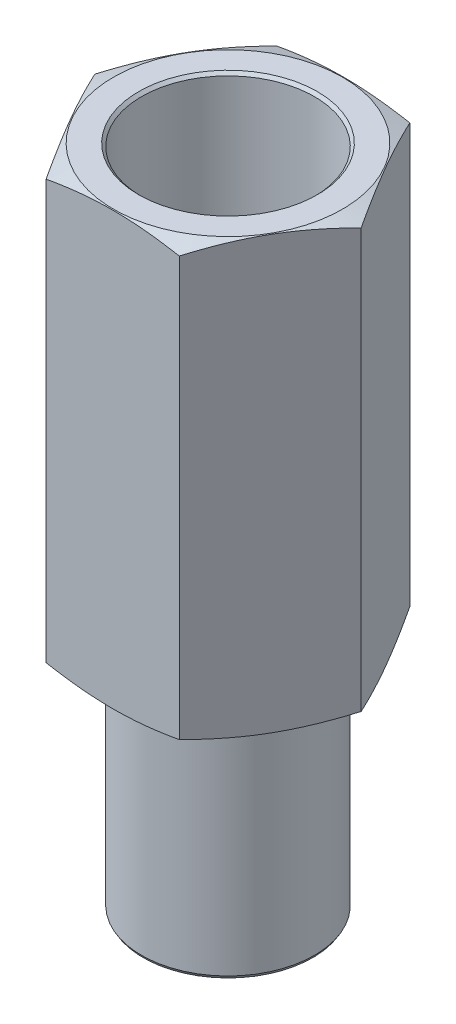
ISO-10303-21;
HEADER;
FILE_DESCRIPTION(('STEP AP214'),'2;1');
FILE_NAME('part.step','',(''),(''),'','','');
FILE_SCHEMA(('AUTOMOTIVE_DESIGN { 1 0 10303 214 1 1 1 1 }'));
ENDSEC;
DATA;
#1=APPLICATION_CONTEXT('core data for automotive mechanical design processes');
#2=APPLICATION_PROTOCOL_DEFINITION('international standard','automotive_design',2000,#1);
#3=PRODUCT_CONTEXT('',#1,'mechanical');
#4=PRODUCT('Part','Part','',(#3));
#5=PRODUCT_RELATED_PRODUCT_CATEGORY('part','',(#4));
#6=PRODUCT_DEFINITION_FORMATION('','',#4);
#7=PRODUCT_DEFINITION_CONTEXT('part definition',#1,'design');
#8=PRODUCT_DEFINITION('design','',#6,#7);
#9=PRODUCT_DEFINITION_SHAPE('','',#8);
#10=(LENGTH_UNIT() NAMED_UNIT(*) SI_UNIT(.MILLI.,.METRE.));
#11=(NAMED_UNIT(*) PLANE_ANGLE_UNIT() SI_UNIT($,.RADIAN.));
#12=(NAMED_UNIT(*) SI_UNIT($,.STERADIAN.) SOLID_ANGLE_UNIT());
#13=UNCERTAINTY_MEASURE_WITH_UNIT(LENGTH_MEASURE(1.E-05),#10,'distance_accuracy_value','');
#14=(GEOMETRIC_REPRESENTATION_CONTEXT(3) GLOBAL_UNCERTAINTY_ASSIGNED_CONTEXT((#13)) GLOBAL_UNIT_ASSIGNED_CONTEXT((#10,
#11,#12)) REPRESENTATION_CONTEXT('',''));
#15=CARTESIAN_POINT('',(0.,0.,0.));
#16=DIRECTION('',(0.,0.,1.));
#17=DIRECTION('',(1.,0.,0.));
#18=AXIS2_PLACEMENT_3D('',#15,#16,#17);
#19=CARTESIAN_POINT('',(0.,15.,0.));
#20=DIRECTION('',(0.,1.,0.));
#21=DIRECTION('',(0.,0.,1.));
#22=AXIS2_PLACEMENT_3D('',#19,#20,#21);
#23=PLANE('',#22);
#24=CARTESIAN_POINT('',(0.,15.,0.));
#25=DIRECTION('',(0.,1.,0.));
#26=DIRECTION('',(0.,0.,1.));
#27=AXIS2_PLACEMENT_3D('',#24,#25,#26);
#28=CIRCLE('',#27,3.10000000000003);
#29=CARTESIAN_POINT('',(0.,15.,3.10000000000003));
#30=VERTEX_POINT('',#29);
#31=EDGE_CURVE('E12',#30,#30,#28,.F.);
#32=ORIENTED_EDGE('',*,*,#31,.T.);
#33=EDGE_LOOP('',(#32));
#34=FACE_BOUND('',#33,.T.);
#35=CARTESIAN_POINT('',(0.,15.,0.));
#36=DIRECTION('',(0.,-1.,0.));
#37=DIRECTION('',(0.,0.,-1.));
#38=AXIS2_PLACEMENT_3D('',#35,#36,#37);
#39=CIRCLE('',#38,3.97080215351701);
#40=CARTESIAN_POINT('',(0.,15.,-3.97080215351701));
#41=VERTEX_POINT('',#40);
#42=EDGE_CURVE('E312',#41,#41,#39,.T.);
#43=ORIENTED_EDGE('',*,*,#42,.F.);
#44=EDGE_LOOP('',(#43));
#45=FACE_BOUND('',#44,.T.);
#46=ADVANCED_FACE('F43',(#34,#45),#23,.T.);
#47=CARTESIAN_POINT('',(0.,-8.48528137423857,0.));
#48=DIRECTION('',(0.,1.,0.));
#49=DIRECTION('',(0.,0.,1.));
#50=AXIS2_PLACEMENT_3D('',#47,#48,#49);
#51=CYLINDRICAL_SURFACE('',#50,3.);
#52=CARTESIAN_POINT('',(0.,14.9,0.));
#53=DIRECTION('',(0.,1.,0.));
#54=DIRECTION('',(0.,0.,1.));
#55=AXIS2_PLACEMENT_3D('',#52,#53,#54);
#56=CIRCLE('',#55,3.);
#57=CARTESIAN_POINT('',(0.,14.9,3.));
#58=VERTEX_POINT('',#57);
#59=EDGE_CURVE('E53',#58,#58,#56,.T.);
#60=CARTESIAN_POINT('',(0.,1.,0.));
#61=DIRECTION('',(0.,1.,0.));
#62=DIRECTION('',(0.,0.,1.));
#63=AXIS2_PLACEMENT_3D('',#60,#61,#62);
#64=CIRCLE('',#63,3.);
#65=CARTESIAN_POINT('',(0.,0.999999999999999,3.));
#66=VERTEX_POINT('',#65);
#67=EDGE_CURVE('E301',#66,#66,#64,.F.);
#68=CARTESIAN_POINT('',(0.,14.9,3.));
#69=CARTESIAN_POINT('',(0.,14.7552083333333,3.));
#70=CARTESIAN_POINT('',(0.,14.6104166666666,3.));
#71=CARTESIAN_POINT('',(0.,14.3208333333333,3.));
#72=CARTESIAN_POINT('',(0.,14.1760416666666,3.));
#73=CARTESIAN_POINT('',(0.,13.8864583333333,3.));
#74=CARTESIAN_POINT('',(0.,13.7416666666666,3.));
#75=CARTESIAN_POINT('',(0.,13.4520833333333,3.));
#76=CARTESIAN_POINT('',(0.,13.3072916666666,3.));
#77=CARTESIAN_POINT('',(0.,13.0177083333333,3.));
#78=CARTESIAN_POINT('',(0.,12.8729166666666,3.));
#79=CARTESIAN_POINT('',(0.,12.5833333333333,3.));
#80=CARTESIAN_POINT('',(0.,12.4385416666666,3.));
#81=CARTESIAN_POINT('',(0.,12.1489583333333,3.));
#82=CARTESIAN_POINT('',(0.,12.0041666666666,3.));
#83=CARTESIAN_POINT('',(0.,11.7145833333333,3.));
#84=CARTESIAN_POINT('',(0.,11.5697916666666,3.));
#85=CARTESIAN_POINT('',(0.,11.2802083333333,3.));
#86=CARTESIAN_POINT('',(0.,11.1354166666666,3.));
#87=CARTESIAN_POINT('',(0.,10.8458333333333,3.));
#88=CARTESIAN_POINT('',(0.,10.7010416666666,3.));
#89=CARTESIAN_POINT('',(0.,10.4114583333333,3.));
#90=CARTESIAN_POINT('',(0.,10.2666666666666,3.));
#91=CARTESIAN_POINT('',(0.,9.97708333333331,3.));
#92=CARTESIAN_POINT('',(0.,9.83229166666664,3.));
#93=CARTESIAN_POINT('',(0.,9.54270833333331,3.));
#94=CARTESIAN_POINT('',(0.,9.39791666666664,3.));
#95=CARTESIAN_POINT('',(0.,9.10833333333331,3.));
#96=CARTESIAN_POINT('',(0.,8.96354166666665,3.));
#97=CARTESIAN_POINT('',(0.,8.67395833333331,3.));
#98=CARTESIAN_POINT('',(0.,8.52916666666665,3.));
#99=CARTESIAN_POINT('',(0.,8.23958333333332,3.));
#100=CARTESIAN_POINT('',(0.,8.09479166666665,3.));
#101=CARTESIAN_POINT('',(0.,7.80520833333331,3.));
#102=CARTESIAN_POINT('',(0.,7.66041666666665,3.));
#103=CARTESIAN_POINT('',(0.,7.37083333333331,3.));
#104=CARTESIAN_POINT('',(0.,7.22604166666665,3.));
#105=CARTESIAN_POINT('',(0.,6.93645833333332,3.));
#106=CARTESIAN_POINT('',(0.,6.79166666666665,3.));
#107=CARTESIAN_POINT('',(0.,6.50208333333332,3.));
#108=CARTESIAN_POINT('',(0.,6.35729166666665,3.));
#109=CARTESIAN_POINT('',(0.,6.06770833333332,3.));
#110=CARTESIAN_POINT('',(0.,5.92291666666665,3.));
#111=CARTESIAN_POINT('',(0.,5.63333333333332,3.));
#112=CARTESIAN_POINT('',(0.,5.48854166666666,3.));
#113=CARTESIAN_POINT('',(0.,5.19895833333332,3.));
#114=CARTESIAN_POINT('',(0.,5.05416666666666,3.));
#115=CARTESIAN_POINT('',(0.,4.76458333333332,3.));
#116=CARTESIAN_POINT('',(0.,4.61979166666666,3.));
#117=CARTESIAN_POINT('',(0.,4.33020833333333,3.));
#118=CARTESIAN_POINT('',(0.,4.18541666666666,3.));
#119=CARTESIAN_POINT('',(0.,3.89583333333333,3.));
#120=CARTESIAN_POINT('',(0.,3.75104166666666,3.));
#121=CARTESIAN_POINT('',(0.,3.46145833333333,3.));
#122=CARTESIAN_POINT('',(0.,3.31666666666666,3.));
#123=CARTESIAN_POINT('',(0.,3.02708333333333,3.));
#124=CARTESIAN_POINT('',(0.,2.88229166666666,3.));
#125=CARTESIAN_POINT('',(0.,2.59270833333333,3.));
#126=CARTESIAN_POINT('',(0.,2.44791666666666,3.));
#127=CARTESIAN_POINT('',(0.,2.15833333333333,3.));
#128=CARTESIAN_POINT('',(0.,2.01354166666666,3.));
#129=CARTESIAN_POINT('',(0.,1.72395833333333,3.));
#130=CARTESIAN_POINT('',(0.,1.57916666666666,3.));
#131=CARTESIAN_POINT('',(0.,1.28958333333333,3.));
#132=CARTESIAN_POINT('',(0.,1.14479166666667,3.));
#133=CARTESIAN_POINT('',(0.,0.999999999999999,3.));
#134=B_SPLINE_CURVE_WITH_KNOTS('',3,(#68,#69,#70,#71,#72,#73,#74,#75,#76,#77,#78,#79,#80,#81,
#82,#83,#84,#85,#86,#87,#88,#89,#90,#91,#92,#93,#94,#95,#96,#97,#98,#99,#100,#101,#102,#103,
#104,#105,#106,#107,#108,#109,#110,#111,#112,#113,#114,#115,#116,#117,#118,#119,#120,#121,#122,
#123,#124,#125,#126,#127,#128,#129,#130,#131,#132,#133),.UNSPECIFIED.,.F.,.F.,(4,2,2,2,2,2,2,2,
2,2,2,2,2,2,2,2,2,2,2,2,2,2,2,2,2,2,2,2,2,2,2,2,4),(0.,0.434375000000001,0.868749999999998,
1.303125,1.7375,2.171875,2.60624999999999,3.04062499999999,3.47499999999999,3.90937499999999,
4.34374999999999,4.77812499999999,5.21249999999999,5.64687499999999,6.08124999999999,
6.51562499999998,6.94999999999998,7.38437499999998,7.81874999999998,8.25312499999998,
8.68749999999998,9.12187499999998,9.55624999999998,9.99062499999997,10.425,10.859375,11.29375,
11.728125,12.1625,12.596875,13.03125,13.465625,13.9),.UNSPECIFIED.);
#135=EDGE_CURVE('BSEAM143',#58,#66,#134,.T.);
#136=ORIENTED_EDGE('',*,*,#59,.T.);
#137=ORIENTED_EDGE('',*,*,#67,.T.);
#138=ORIENTED_EDGE('',*,*,#135,.T.);
#139=ORIENTED_EDGE('',*,*,#135,.F.);
#140=EDGE_LOOP('',(#136,#138,#137,#139));
#141=FACE_BOUND('',#140,.T.);
#142=ADVANCED_FACE('F143',(#141),#51,.F.);
#143=CARTESIAN_POINT('',(0.,1.,0.));
#144=DIRECTION('',(0.,1.,0.));
#145=DIRECTION('',(0.,0.,1.));
#146=AXIS2_PLACEMENT_3D('',#143,#144,#145);
#147=PLANE('',#146);
#148=ORIENTED_EDGE('',*,*,#67,.F.);
#149=EDGE_LOOP('',(#148));
#150=FACE_BOUND('',#149,.T.);
#151=ADVANCED_FACE('F161',(#150),#147,.T.);
#152=CARTESIAN_POINT('',(0.,14.7641472881955,0.));
#153=DIRECTION('',(0.,-1.,0.));
#154=DIRECTION('',(0.,0.,-1.));
#155=AXIS2_PLACEMENT_3D('',#152,#153,#154);
#156=CONICAL_SURFACE('',#155,4.61880215351701,1.22173047639604);
#157=ORIENTED_EDGE('',*,*,#42,.T.);
#158=EDGE_LOOP('',(#157));
#159=FACE_BOUND('',#158,.T.);
#160=CARTESIAN_POINT('',(4.61891762357085,14.764105258957,0.000199999999999064));
#161=CARTESIAN_POINT('',(4.52327074349373,14.7989319273994,-0.165465255879011));
#162=CARTESIAN_POINT('',(4.42730844809341,14.8306128881345,-0.331676827123302));
#163=CARTESIAN_POINT('',(4.23475986069894,14.8863507330612,-0.66518076341613));
#164=CARTESIAN_POINT('',(4.1381731403285,14.9104016505121,-0.832473870434188));
#165=CARTESIAN_POINT('',(3.9454476649718,14.9493033550701,-1.16628418566486));
#166=CARTESIAN_POINT('',(3.84931331199851,14.9642389981062,-1.33279376936735));
#167=CARTESIAN_POINT('',(3.65681977912949,14.9842719022397,-1.66620234842492));
#168=CARTESIAN_POINT('',(3.56046069713362,14.9893728529755,-1.83310117421246));
#169=CARTESIAN_POINT('',(3.36774253314189,14.9893728529755,-2.16689882578754));
#170=CARTESIAN_POINT('',(3.27138345114602,14.9842719022397,-2.33379765157508));
#171=CARTESIAN_POINT('',(3.078889918277,14.9642389981062,-2.66720623063265));
#172=CARTESIAN_POINT('',(2.98275556530371,14.9493033550701,-2.83371581433514));
#173=CARTESIAN_POINT('',(2.79003008994701,14.9104016505121,-3.16752612956581));
#174=CARTESIAN_POINT('',(2.69344336957657,14.8863507330612,-3.33481923658387));
#175=CARTESIAN_POINT('',(2.5008947821821,14.8306128881345,-3.6683231728767));
#176=CARTESIAN_POINT('',(2.40493248678178,14.7989319273994,-3.83453474412099));
#177=CARTESIAN_POINT('',(2.30928560670466,14.764105258957,-4.0002));
#178=B_SPLINE_CURVE_WITH_KNOTS('',3,(#160,#161,#162,#163,#164,#165,#166,#167,#168,#169,#170,
#171,#172,#173,#174,#175,#176,#177),.UNSPECIFIED.,.F.,.F.,(4,2,2,2,2,2,2,2,4),(0.,
0.583374670479608,1.16720442537842,1.74551281639333,2.32360420373111,2.90169559106889,
3.4800039820838,4.06383373698261,4.64720840746222),.UNSPECIFIED.);
#179=CARTESIAN_POINT('',(4.61880215351701,14.7641472881955,0.));
#180=VERTEX_POINT('',#179);
#181=CARTESIAN_POINT('',(2.3094010767585,14.7641472881955,-4.));
#182=VERTEX_POINT('',#181);
#183=EDGE_CURVE('E238',#180,#182,#178,.T.);
#184=ORIENTED_EDGE('',*,*,#183,.T.);
#185=CARTESIAN_POINT('',(6.93442105541701,13.5315317912641,-4.));
#186=CARTESIAN_POINT('',(6.79750528587559,13.5746962779455,-4.));
#187=CARTESIAN_POINT('',(6.66049928600478,13.6175745312444,-4.));
#188=CARTESIAN_POINT('',(6.38627763681627,13.7026615681037,-4.));
#189=CARTESIAN_POINT('',(6.24906198472095,13.7448703427085,-4.));
#190=CARTESIAN_POINT('',(5.83700082601678,13.8703639282712,-4.));
#191=CARTESIAN_POINT('',(5.56180233931622,13.9524966047382,-4.));
#192=CARTESIAN_POINT('',(5.00612466327753,14.1137770625323,-4.));
#193=CARTESIAN_POINT('',(4.72562742696804,14.1928630038912,-4.));
#194=CARTESIAN_POINT('',(4.16301593649549,14.3450721585253,-4.));
#195=CARTESIAN_POINT('',(3.88090174431779,14.4181955987557,-4.));
#196=CARTESIAN_POINT('',(3.32667471581513,14.5530931283784,-4.));
#197=CARTESIAN_POINT('',(3.05464851367353,14.6152182616514,-4.));
#198=CARTESIAN_POINT('',(2.50830917239681,14.7287453849072,-4.));
#199=CARTESIAN_POINT('',(2.23399588098652,14.7801466548659,-4.));
#200=CARTESIAN_POINT('',(1.68506942754389,14.8679792334375,-4.));
#201=CARTESIAN_POINT('',(1.41047515442929,14.904523748679,-4.));
#202=CARTESIAN_POINT('',(0.997259291342989,14.945585287118,-4.));
#203=CARTESIAN_POINT('',(0.859310804317415,14.9569795729521,-4.));
#204=CARTESIAN_POINT('',(0.583097750576372,14.9748161793434,-4.));
#205=CARTESIAN_POINT('',(0.444833206757896,14.9812588478914,-4.));
#206=CARTESIAN_POINT('',(0.155947129212635,14.9892910803361,-4.));
#207=CARTESIAN_POINT('',(0.00531195858881917,14.9904021547164,-4.));
#208=CARTESIAN_POINT('',(-0.295876555366577,14.9864236091773,-4.));
#209=CARTESIAN_POINT('',(-0.446429897623009,14.9813339096659,-4.));
#210=CARTESIAN_POINT('',(-0.747251476084304,14.9651769648813,-4.));
#211=CARTESIAN_POINT('',(-0.897519627044852,14.9541081503623,-4.));
#212=CARTESIAN_POINT('',(-1.19755177599525,14.9264442809033,-4.));
#213=CARTESIAN_POINT('',(-1.34731572409171,14.9098486944082,-4.));
#214=CARTESIAN_POINT('',(-1.7981263182841,14.8523443810178,-4.));
#215=CARTESIAN_POINT('',(-2.09821280481539,14.8038686192461,-4.));
#216=CARTESIAN_POINT('',(-2.6955298983362,14.6921414652265,-4.));
#217=CARTESIAN_POINT('',(-2.9927602619385,14.6288888251767,-4.));
#218=CARTESIAN_POINT('',(-3.59903309296772,14.4887443018965,-4.));
#219=CARTESIAN_POINT('',(-3.90795602267499,14.4113427018586,-4.));
#220=CARTESIAN_POINT('',(-4.52371095938154,14.2487563960846,-4.));
#221=CARTESIAN_POINT('',(-4.83054300430409,14.1635718319174,-4.));
#222=CARTESIAN_POINT('',(-5.43754564117105,13.9892562325163,-4.));
#223=CARTESIAN_POINT('',(-5.73774206315821,13.9002145638166,-4.));
#224=CARTESIAN_POINT('',(-6.18713862393114,13.763855156661,-4.));
#225=CARTESIAN_POINT('',(-6.33676810815596,13.717942114902,-4.));
#226=CARTESIAN_POINT('',(-6.63577438261097,13.6253097199274,-4.));
#227=CARTESIAN_POINT('',(-6.78515117745355,13.5785903816075,-4.));
#228=CARTESIAN_POINT('',(-6.93442105541701,13.5315317912641,-4.));
#229=B_SPLINE_CURVE_WITH_KNOTS('',3,(#185,#186,#187,#188,#189,#190,#191,#192,#193,#194,#195,
#196,#197,#198,#199,#200,#201,#202,#203,#204,#205,#206,#207,#208,#209,#210,#211,#212,#213,#214,
#215,#216,#217,#218,#219,#220,#221,#222,#223,#224,#225,#226,#227,#228),.UNSPECIFIED.,.F.,.F.,(4,
2,2,2,2,2,2,2,2,2,2,2,2,2,2,2,2,2,2,2,2,4),(0.,0.43067550758346,0.861356771401509,
1.7229119540411,2.5971661165428,3.47138698608137,4.30832109554915,5.14531138057395,
5.97579864841235,6.39097713249059,6.80612643591046,7.2579145452663,7.70970845374372,
8.16162099523028,8.61357701342838,9.52492298706625,10.4363459451995,11.3916096929876,
12.346856068385,13.2861915769522,13.7557353954807,14.22527054881),.UNSPECIFIED.);
#230=CARTESIAN_POINT('',(-2.3094010767585,14.7641472881955,-4.));
#231=VERTEX_POINT('',#230);
#232=EDGE_CURVE('E119',#182,#231,#229,.T.);
#233=ORIENTED_EDGE('',*,*,#232,.T.);
#234=CARTESIAN_POINT('',(-2.30928560670467,14.764105258957,-4.0002));
#235=CARTESIAN_POINT('',(-2.40493248678178,14.7989319273994,-3.83453474412099));
#236=CARTESIAN_POINT('',(-2.5008947821821,14.8306128881345,-3.6683231728767));
#237=CARTESIAN_POINT('',(-2.69344336957657,14.8863507330612,-3.33481923658387));
#238=CARTESIAN_POINT('',(-2.79003008994701,14.9104016505121,-3.16752612956581));
#239=CARTESIAN_POINT('',(-2.98275556530371,14.9493033550701,-2.83371581433514));
#240=CARTESIAN_POINT('',(-3.078889918277,14.9642389981062,-2.66720623063265));
#241=CARTESIAN_POINT('',(-3.27138345114602,14.9842719022397,-2.33379765157508));
#242=CARTESIAN_POINT('',(-3.36774253314189,14.9893728529755,-2.16689882578754));
#243=CARTESIAN_POINT('',(-3.56046069713362,14.9893728529755,-1.83310117421246));
#244=CARTESIAN_POINT('',(-3.65681977912949,14.9842719022397,-1.66620234842492));
#245=CARTESIAN_POINT('',(-3.84931331199851,14.9642389981062,-1.33279376936735));
#246=CARTESIAN_POINT('',(-3.9454476649718,14.9493033550701,-1.16628418566486));
#247=CARTESIAN_POINT('',(-4.1381731403285,14.9104016505121,-0.832473870434188));
#248=CARTESIAN_POINT('',(-4.23475986069894,14.8863507330612,-0.66518076341613));
#249=CARTESIAN_POINT('',(-4.42730844809341,14.8306128881345,-0.331676827123302));
#250=CARTESIAN_POINT('',(-4.52327074349373,14.7989319273994,-0.165465255879012));
#251=CARTESIAN_POINT('',(-4.61891762357084,14.764105258957,0.000199999999998637));
#252=B_SPLINE_CURVE_WITH_KNOTS('',3,(#234,#235,#236,#237,#238,#239,#240,#241,#242,#243,#244,
#245,#246,#247,#248,#249,#250,#251),.UNSPECIFIED.,.F.,.F.,(4,2,2,2,2,2,2,2,4),(0.,
0.583374670479609,1.16720442537842,1.74551281639333,2.32360420373111,2.90169559106889,
3.4800039820838,4.06383373698261,4.64720840746222),.UNSPECIFIED.);
#253=CARTESIAN_POINT('',(-4.61880215351701,14.7641472881955,0.));
#254=VERTEX_POINT('',#253);
#255=EDGE_CURVE('E225',#231,#254,#252,.T.);
#256=ORIENTED_EDGE('',*,*,#255,.T.);
#257=CARTESIAN_POINT('',(-4.61891762357084,14.764105258957,-0.000200000000001024));
#258=CARTESIAN_POINT('',(-4.52327074349373,14.7989319273994,0.165465255879009));
#259=CARTESIAN_POINT('',(-4.42730844809341,14.8306128881345,0.3316768271233));
#260=CARTESIAN_POINT('',(-4.23475986069894,14.8863507330612,0.665180763416128));
#261=CARTESIAN_POINT('',(-4.1381731403285,14.9104016505121,0.832473870434186));
#262=CARTESIAN_POINT('',(-3.9454476649718,14.9493033550701,1.16628418566486));
#263=CARTESIAN_POINT('',(-3.84931331199851,14.9642389981062,1.33279376936735));
#264=CARTESIAN_POINT('',(-3.65681977912949,14.9842719022397,1.66620234842492));
#265=CARTESIAN_POINT('',(-3.56046069713362,14.9893728529755,1.83310117421246));
#266=CARTESIAN_POINT('',(-3.36774253314189,14.9893728529755,2.16689882578754));
#267=CARTESIAN_POINT('',(-3.27138345114602,14.9842719022397,2.33379765157508));
#268=CARTESIAN_POINT('',(-3.078889918277,14.9642389981062,2.66720623063265));
#269=CARTESIAN_POINT('',(-2.98275556530371,14.9493033550701,2.83371581433514));
#270=CARTESIAN_POINT('',(-2.79003008994701,14.9104016505121,3.16752612956581));
#271=CARTESIAN_POINT('',(-2.69344336957657,14.8863507330612,3.33481923658387));
#272=CARTESIAN_POINT('',(-2.5008947821821,14.8306128881345,3.6683231728767));
#273=CARTESIAN_POINT('',(-2.40493248678178,14.7989319273994,3.83453474412099));
#274=CARTESIAN_POINT('',(-2.30928560670466,14.764105258957,4.0002));
#275=B_SPLINE_CURVE_WITH_KNOTS('',3,(#257,#258,#259,#260,#261,#262,#263,#264,#265,#266,#267,
#268,#269,#270,#271,#272,#273,#274),.UNSPECIFIED.,.F.,.F.,(4,2,2,2,2,2,2,2,4),(0.,
0.583374670479608,1.16720442537842,1.74551281639333,2.32360420373111,2.90169559106889,
3.4800039820838,4.06383373698261,4.64720840746222),.UNSPECIFIED.);
#276=CARTESIAN_POINT('',(-2.30940107675851,14.7641472881955,4.));
#277=VERTEX_POINT('',#276);
#278=EDGE_CURVE('E219',#254,#277,#275,.T.);
#279=ORIENTED_EDGE('',*,*,#278,.T.);
#280=CARTESIAN_POINT('',(-6.93442105541701,13.5315317912641,4.));
#281=CARTESIAN_POINT('',(-6.79750528587559,13.5746962779455,4.));
#282=CARTESIAN_POINT('',(-6.66049928600478,13.6175745312444,4.));
#283=CARTESIAN_POINT('',(-6.38627763681627,13.7026615681037,4.));
#284=CARTESIAN_POINT('',(-6.24906198472095,13.7448703427085,4.));
#285=CARTESIAN_POINT('',(-5.83700082601678,13.8703639282712,4.));
#286=CARTESIAN_POINT('',(-5.56180233931622,13.9524966047382,4.));
#287=CARTESIAN_POINT('',(-5.00612466327753,14.1137770625323,4.));
#288=CARTESIAN_POINT('',(-4.72562742696804,14.1928630038912,4.));
#289=CARTESIAN_POINT('',(-4.16301593649549,14.3450721585253,4.));
#290=CARTESIAN_POINT('',(-3.88090174431779,14.4181955987557,4.));
#291=CARTESIAN_POINT('',(-3.32667471581513,14.5530931283784,4.));
#292=CARTESIAN_POINT('',(-3.05464851367353,14.6152182616514,4.));
#293=CARTESIAN_POINT('',(-2.50830917239681,14.7287453849072,4.));
#294=CARTESIAN_POINT('',(-2.23399588098652,14.7801466548659,4.));
#295=CARTESIAN_POINT('',(-1.68506942754389,14.8679792334375,4.));
#296=CARTESIAN_POINT('',(-1.4104751544293,14.904523748679,4.));
#297=CARTESIAN_POINT('',(-0.997259291342992,14.945585287118,4.));
#298=CARTESIAN_POINT('',(-0.859310804317418,14.9569795729521,4.));
#299=CARTESIAN_POINT('',(-0.583097750576375,14.9748161793434,4.));
#300=CARTESIAN_POINT('',(-0.444833206757899,14.9812588478914,4.));
#301=CARTESIAN_POINT('',(-0.155947129212638,14.9892910803361,4.));
#302=CARTESIAN_POINT('',(-0.00531195858882182,14.9904021547164,4.));
#303=CARTESIAN_POINT('',(0.295876555366575,14.9864236091773,4.));
#304=CARTESIAN_POINT('',(0.446429897623007,14.9813339096659,4.));
#305=CARTESIAN_POINT('',(0.747251476084302,14.9651769648813,4.));
#306=CARTESIAN_POINT('',(0.897519627044849,14.9541081503623,4.));
#307=CARTESIAN_POINT('',(1.19755177599524,14.9264442809033,4.));
#308=CARTESIAN_POINT('',(1.34731572409171,14.9098486944082,4.));
#309=CARTESIAN_POINT('',(1.7981263182841,14.8523443810178,4.));
#310=CARTESIAN_POINT('',(2.09821280481539,14.8038686192461,4.));
#311=CARTESIAN_POINT('',(2.6955298983362,14.6921414652265,4.));
#312=CARTESIAN_POINT('',(2.9927602619385,14.6288888251767,4.));
#313=CARTESIAN_POINT('',(3.59903309296772,14.4887443018965,4.));
#314=CARTESIAN_POINT('',(3.90795602267499,14.4113427018586,4.));
#315=CARTESIAN_POINT('',(4.52371095938154,14.2487563960846,4.));
#316=CARTESIAN_POINT('',(4.83054300430409,14.1635718319174,4.));
#317=CARTESIAN_POINT('',(5.43754564117105,13.9892562325163,4.));
#318=CARTESIAN_POINT('',(5.73774206315821,13.9002145638166,4.));
#319=CARTESIAN_POINT('',(6.18713862393114,13.763855156661,4.));
#320=CARTESIAN_POINT('',(6.33676810815596,13.717942114902,4.));
#321=CARTESIAN_POINT('',(6.63577438261097,13.6253097199274,4.));
#322=CARTESIAN_POINT('',(6.78515117745355,13.5785903816075,4.));
#323=CARTESIAN_POINT('',(6.93442105541701,13.5315317912641,4.));
#324=B_SPLINE_CURVE_WITH_KNOTS('',3,(#280,#281,#282,#283,#284,#285,#286,#287,#288,#289,#290,
#291,#292,#293,#294,#295,#296,#297,#298,#299,#300,#301,#302,#303,#304,#305,#306,#307,#308,#309,
#310,#311,#312,#313,#314,#315,#316,#317,#318,#319,#320,#321,#322,#323),.UNSPECIFIED.,.F.,.F.,(4,
2,2,2,2,2,2,2,2,2,2,2,2,2,2,2,2,2,2,2,2,4),(0.,0.43067550758346,0.86135677140151,
1.7229119540411,2.5971661165428,3.47138698608136,4.30832109554915,5.14531138057395,
5.97579864841235,6.39097713249058,6.80612643591046,7.2579145452663,7.70970845374372,
8.16162099523028,8.61357701342838,9.52492298706625,10.4363459451995,11.3916096929876,
12.346856068385,13.2861915769522,13.7557353954807,14.22527054881),.UNSPECIFIED.);
#325=CARTESIAN_POINT('',(2.3094010767585,14.7641472881955,4.));
#326=VERTEX_POINT('',#325);
#327=EDGE_CURVE('E60',#277,#326,#324,.T.);
#328=ORIENTED_EDGE('',*,*,#327,.T.);
#329=CARTESIAN_POINT('',(2.30928560670467,14.764105258957,4.0002));
#330=CARTESIAN_POINT('',(2.40493248678178,14.7989319273994,3.83453474412099));
#331=CARTESIAN_POINT('',(2.5008947821821,14.8306128881345,3.6683231728767));
#332=CARTESIAN_POINT('',(2.69344336957657,14.8863507330612,3.33481923658387));
#333=CARTESIAN_POINT('',(2.79003008994701,14.9104016505121,3.16752612956581));
#334=CARTESIAN_POINT('',(2.98275556530371,14.9493033550701,2.83371581433514));
#335=CARTESIAN_POINT('',(3.078889918277,14.9642389981062,2.66720623063265));
#336=CARTESIAN_POINT('',(3.27138345114602,14.9842719022397,2.33379765157508));
#337=CARTESIAN_POINT('',(3.36774253314189,14.9893728529755,2.16689882578754));
#338=CARTESIAN_POINT('',(3.56046069713362,14.9893728529755,1.83310117421246));
#339=CARTESIAN_POINT('',(3.65681977912949,14.9842719022397,1.66620234842492));
#340=CARTESIAN_POINT('',(3.84931331199851,14.9642389981062,1.33279376936735));
#341=CARTESIAN_POINT('',(3.9454476649718,14.9493033550701,1.16628418566486));
#342=CARTESIAN_POINT('',(4.1381731403285,14.9104016505121,0.832473870434186));
#343=CARTESIAN_POINT('',(4.23475986069894,14.8863507330612,0.665180763416128));
#344=CARTESIAN_POINT('',(4.42730844809341,14.8306128881345,0.3316768271233));
#345=CARTESIAN_POINT('',(4.52327074349373,14.7989319273994,0.165465255879009));
#346=CARTESIAN_POINT('',(4.61891762357085,14.764105258957,-0.000200000000001258));
#347=B_SPLINE_CURVE_WITH_KNOTS('',3,(#329,#330,#331,#332,#333,#334,#335,#336,#337,#338,#339,
#340,#341,#342,#343,#344,#345,#346),.UNSPECIFIED.,.F.,.F.,(4,2,2,2,2,2,2,2,4),(0.,
0.583374670479608,1.16720442537842,1.74551281639333,2.32360420373111,2.90169559106889,
3.4800039820838,4.06383373698261,4.64720840746222),.UNSPECIFIED.);
#348=EDGE_CURVE('E115',#326,#180,#347,.T.);
#349=ORIENTED_EDGE('',*,*,#348,.T.);
#350=EDGE_LOOP('',(#184,#233,#256,#279,#328,#349));
#351=FACE_BOUND('',#350,.T.);
#352=ADVANCED_FACE('F176',(#159,#351),#156,.T.);
#353=CARTESIAN_POINT('',(2.3094010767585,15.,4.));
#354=DIRECTION('',(-0.866025403784438,0.,-0.5));
#355=DIRECTION('',(-0.5,0.,0.866025403784439));
#356=AXIS2_PLACEMENT_3D('',#353,#354,#355);
#357=PLANE('',#356);
#358=CARTESIAN_POINT('',(4.61891762357085,0.235894741043041,-0.000200000000001065));
#359=CARTESIAN_POINT('',(4.52327074349373,0.201068072600558,0.165465255879009));
#360=CARTESIAN_POINT('',(4.42730844809341,0.169387111865529,0.3316768271233));
#361=CARTESIAN_POINT('',(4.23475986069894,0.113649266938842,0.665180763416128));
#362=CARTESIAN_POINT('',(4.1381731403285,0.0895983494878928,0.832473870434186));
#363=CARTESIAN_POINT('',(3.9454476649718,0.0506966449299209,1.16628418566486));
#364=CARTESIAN_POINT('',(3.84931331199851,0.0357610018938267,1.33279376936735));
#365=CARTESIAN_POINT('',(3.65681977912949,0.0157280977603333,1.66620234842492));
#366=CARTESIAN_POINT('',(3.56046069713362,0.0106271470244839,1.83310117421246));
#367=CARTESIAN_POINT('',(3.36774253314189,0.0106271470244839,2.16689882578754));
#368=CARTESIAN_POINT('',(3.27138345114602,0.0157280977603332,2.33379765157508));
#369=CARTESIAN_POINT('',(3.078889918277,0.0357610018938266,2.66720623063265));
#370=CARTESIAN_POINT('',(2.98275556530371,0.0506966449299208,2.83371581433514));
#371=CARTESIAN_POINT('',(2.79003008994701,0.0895983494878925,3.16752612956581));
#372=CARTESIAN_POINT('',(2.69344336957657,0.113649266938842,3.33481923658387));
#373=CARTESIAN_POINT('',(2.5008947821821,0.169387111865528,3.6683231728767));
#374=CARTESIAN_POINT('',(2.40493248678178,0.201068072600557,3.83453474412099));
#375=CARTESIAN_POINT('',(2.30928560670467,0.23589474104304,4.0002));
#376=B_SPLINE_CURVE_WITH_KNOTS('',3,(#358,#359,#360,#361,#362,#363,#364,#365,#366,#367,#368,
#369,#370,#371,#372,#373,#374,#375),.UNSPECIFIED.,.F.,.F.,(4,2,2,2,2,2,2,2,4),(0.,
0.583374670479608,1.16720442537842,1.74551281639333,2.32360420373111,2.90169559106889,
3.4800039820838,4.06383373698261,4.64720840746222),.UNSPECIFIED.);
#377=CARTESIAN_POINT('',(4.61880215351701,0.235852711804495,0.));
#378=VERTEX_POINT('',#377);
#379=CARTESIAN_POINT('',(2.3094010767585,0.235852711804495,4.));
#380=VERTEX_POINT('',#379);
#381=EDGE_CURVE('E182',#378,#380,#376,.T.);
#382=ORIENTED_EDGE('',*,*,#381,.F.);
#383=DIRECTION('',(0.,-1.,0.));
#384=VECTOR('',#383,1.);
#385=CARTESIAN_POINT('',(4.61880215351701,15.,0.));
#386=LINE('',#385,#384);
#387=EDGE_CURVE('E113',#180,#378,#386,.T.);
#388=ORIENTED_EDGE('',*,*,#387,.F.);
#389=ORIENTED_EDGE('',*,*,#348,.F.);
#390=DIRECTION('',(0.,-1.,0.));
#391=VECTOR('',#390,1.);
#392=CARTESIAN_POINT('',(2.3094010767585,15.,4.));
#393=LINE('',#392,#391);
#394=EDGE_CURVE('E294',#326,#380,#393,.T.);
#395=ORIENTED_EDGE('',*,*,#394,.T.);
#396=EDGE_LOOP('',(#382,#388,#389,#395));
#397=FACE_BOUND('',#396,.T.);
#398=ADVANCED_FACE('F171',(#397),#357,.F.);
#399=CARTESIAN_POINT('',(-2.3094010767585,15.,4.));
#400=DIRECTION('',(0.,0.,-1.));
#401=DIRECTION('',(-1.,0.,0.));
#402=AXIS2_PLACEMENT_3D('',#399,#400,#401);
#403=PLANE('',#402);
#404=CARTESIAN_POINT('',(6.93442105541701,1.46846820873595,4.));
#405=CARTESIAN_POINT('',(6.79750528587559,1.42530372205454,4.));
#406=CARTESIAN_POINT('',(6.66049928600478,1.3824254687556,4.));
#407=CARTESIAN_POINT('',(6.38627763681627,1.29733843189633,4.));
#408=CARTESIAN_POINT('',(6.24906198472096,1.25512965729153,4.));
#409=CARTESIAN_POINT('',(5.83700082601679,1.12963607172881,4.));
#410=CARTESIAN_POINT('',(5.56180233931623,1.04750339526185,4.));
#411=CARTESIAN_POINT('',(5.00612466327755,0.886222937467692,4.));
#412=CARTESIAN_POINT('',(4.72562742696805,0.807136996108761,4.));
#413=CARTESIAN_POINT('',(4.16301593649551,0.654927841474713,4.));
#414=CARTESIAN_POINT('',(3.88090174431781,0.581804401244294,4.));
#415=CARTESIAN_POINT('',(3.32667471581515,0.446906871621624,4.));
#416=CARTESIAN_POINT('',(3.05464851367355,0.384781738348636,4.));
#417=CARTESIAN_POINT('',(2.50830917239683,0.271254615092766,4.));
#418=CARTESIAN_POINT('',(2.23399588098654,0.219853345134058,4.));
#419=CARTESIAN_POINT('',(1.68506942754392,0.132020766562519,4.));
#420=CARTESIAN_POINT('',(1.41047515442933,0.095476251320985,4.));
#421=CARTESIAN_POINT('',(0.997259291343024,0.0544147128819589,4.));
#422=CARTESIAN_POINT('',(0.859310804317451,0.0430204270479422,4.));
#423=CARTESIAN_POINT('',(0.58309775057641,0.0251838206566128,4.));
#424=CARTESIAN_POINT('',(0.444833206757935,0.0187411521086326,4.));
#425=CARTESIAN_POINT('',(0.155947129212674,0.010708919663933,4.));
#426=CARTESIAN_POINT('',(0.0053119585888566,0.00959784528355729,4.));
#427=CARTESIAN_POINT('',(-0.295876555366542,0.0135763908226936,4.));
#428=CARTESIAN_POINT('',(-0.446429897622974,0.0186660903340807,4.));
#429=CARTESIAN_POINT('',(-0.747251476084271,0.034823035118695,4.));
#430=CARTESIAN_POINT('',(-0.89751962704482,0.0458918496377199,4.));
#431=CARTESIAN_POINT('',(-1.19755177599522,0.073555719096668,4.));
#432=CARTESIAN_POINT('',(-1.34731572409169,0.0901513055917945,4.));
#433=CARTESIAN_POINT('',(-1.79812631828407,0.147655618982208,4.));
#434=CARTESIAN_POINT('',(-2.09821280481537,0.196131380753924,4.));
#435=CARTESIAN_POINT('',(-2.69552989833618,0.30785853477353,4.));
#436=CARTESIAN_POINT('',(-2.99276026193848,0.371111174823291,4.));
#437=CARTESIAN_POINT('',(-3.5990330929677,0.511255698103514,4.));
#438=CARTESIAN_POINT('',(-3.90795602267497,0.588657298141389,4.));
#439=CARTESIAN_POINT('',(-4.52371095938153,0.751243603915377,4.));
#440=CARTESIAN_POINT('',(-4.83054300430409,0.836428168082622,4.));
#441=CARTESIAN_POINT('',(-5.43754564117104,1.01074376748371,4.));
#442=CARTESIAN_POINT('',(-5.73774206315821,1.09978543618339,4.));
#443=CARTESIAN_POINT('',(-6.18713862393114,1.23614484333896,4.));
#444=CARTESIAN_POINT('',(-6.33676810815596,1.28205788509802,4.));
#445=CARTESIAN_POINT('',(-6.63577438261097,1.37469028007264,4.));
#446=CARTESIAN_POINT('',(-6.78515117745355,1.42140961839248,4.));
#447=CARTESIAN_POINT('',(-6.93442105541701,1.46846820873595,4.));
#448=B_SPLINE_CURVE_WITH_KNOTS('',3,(#404,#405,#406,#407,#408,#409,#410,#411,#412,#413,#414,
#415,#416,#417,#418,#419,#420,#421,#422,#423,#424,#425,#426,#427,#428,#429,#430,#431,#432,#433,
#434,#435,#436,#437,#438,#439,#440,#441,#442,#443,#444,#445,#446,#447),.UNSPECIFIED.,.F.,.F.,(4,
2,2,2,2,2,2,2,2,2,2,2,2,2,2,2,2,2,2,2,2,4),(0.,0.430675507583459,0.861356771401505,
1.72291195404109,2.59716611654279,3.47138698608135,4.30832109554913,5.14531138057393,
5.97579864841232,6.39097713249055,6.80612643591042,7.25791454526627,7.70970845374369,
8.16162099523025,8.61357701342835,9.52492298706623,10.4363459451994,11.3916096929876,
12.346856068385,13.2861915769522,13.7557353954807,14.22527054881),.UNSPECIFIED.);
#449=CARTESIAN_POINT('',(-2.3094010767585,0.235852711804495,4.));
#450=VERTEX_POINT('',#449);
#451=EDGE_CURVE('E267',#380,#450,#448,.T.);
#452=ORIENTED_EDGE('',*,*,#451,.F.);
#453=ORIENTED_EDGE('',*,*,#394,.F.);
#454=ORIENTED_EDGE('',*,*,#327,.F.);
#455=DIRECTION('',(0.,-1.,0.));
#456=VECTOR('',#455,1.);
#457=CARTESIAN_POINT('',(-2.3094010767585,15.,4.));
#458=LINE('',#457,#456);
#459=EDGE_CURVE('E288',#277,#450,#458,.T.);
#460=ORIENTED_EDGE('',*,*,#459,.T.);
#461=EDGE_LOOP('',(#452,#453,#454,#460));
#462=FACE_BOUND('',#461,.T.);
#463=ADVANCED_FACE('F175',(#462),#403,.F.);
#464=CARTESIAN_POINT('',(-4.61880215351701,15.,0.));
#465=DIRECTION('',(0.866025403784438,0.,-0.5));
#466=DIRECTION('',(-0.5,0.,-0.866025403784439));
#467=AXIS2_PLACEMENT_3D('',#464,#465,#466);
#468=PLANE('',#467);
#469=CARTESIAN_POINT('',(-2.30928560670466,0.23589474104304,4.0002));
#470=CARTESIAN_POINT('',(-2.40493248678178,0.201068072600557,3.83453474412099));
#471=CARTESIAN_POINT('',(-2.5008947821821,0.169387111865528,3.6683231728767));
#472=CARTESIAN_POINT('',(-2.69344336957657,0.113649266938842,3.33481923658387));
#473=CARTESIAN_POINT('',(-2.79003008994701,0.0895983494878924,3.16752612956581));
#474=CARTESIAN_POINT('',(-2.98275556530371,0.0506966449299206,2.83371581433514));
#475=CARTESIAN_POINT('',(-3.078889918277,0.0357610018938263,2.66720623063265));
#476=CARTESIAN_POINT('',(-3.27138345114602,0.015728097760333,2.33379765157508));
#477=CARTESIAN_POINT('',(-3.36774253314189,0.0106271470244838,2.16689882578754));
#478=CARTESIAN_POINT('',(-3.56046069713362,0.0106271470244838,1.83310117421246));
#479=CARTESIAN_POINT('',(-3.65681977912949,0.015728097760333,1.66620234842492));
#480=CARTESIAN_POINT('',(-3.84931331199851,0.0357610018938262,1.33279376936735));
#481=CARTESIAN_POINT('',(-3.9454476649718,0.0506966449299203,1.16628418566486));
#482=CARTESIAN_POINT('',(-4.1381731403285,0.0895983494878922,0.832473870434187));
#483=CARTESIAN_POINT('',(-4.23475986069894,0.113649266938842,0.66518076341613));
#484=CARTESIAN_POINT('',(-4.42730844809341,0.169387111865528,0.331676827123301));
#485=CARTESIAN_POINT('',(-4.52327074349373,0.201068072600557,0.16546525587901));
#486=CARTESIAN_POINT('',(-4.61891762357084,0.23589474104304,-0.000200000000000051));
#487=B_SPLINE_CURVE_WITH_KNOTS('',3,(#469,#470,#471,#472,#473,#474,#475,#476,#477,#478,#479,
#480,#481,#482,#483,#484,#485,#486),.UNSPECIFIED.,.F.,.F.,(4,2,2,2,2,2,2,2,4),(0.,
0.583374670479608,1.16720442537842,1.74551281639333,2.32360420373111,2.90169559106889,
3.4800039820838,4.06383373698261,4.64720840746222),.UNSPECIFIED.);
#488=CARTESIAN_POINT('',(-4.618802153517,0.235852711804495,0.));
#489=VERTEX_POINT('',#488);
#490=EDGE_CURVE('E261',#450,#489,#487,.T.);
#491=ORIENTED_EDGE('',*,*,#490,.F.);
#492=ORIENTED_EDGE('',*,*,#459,.F.);
#493=ORIENTED_EDGE('',*,*,#278,.F.);
#494=DIRECTION('',(0.,-1.,0.));
#495=VECTOR('',#494,1.);
#496=CARTESIAN_POINT('',(-4.61880215351701,15.,0.));
#497=LINE('',#496,#495);
#498=EDGE_CURVE('E129',#254,#489,#497,.T.);
#499=ORIENTED_EDGE('',*,*,#498,.T.);
#500=EDGE_LOOP('',(#491,#492,#493,#499));
#501=FACE_BOUND('',#500,.T.);
#502=ADVANCED_FACE('F272',(#501),#468,.F.);
#503=CARTESIAN_POINT('',(-2.3094010767585,15.,-4.));
#504=DIRECTION('',(0.866025403784439,0.,0.5));
#505=DIRECTION('',(0.5,0.,-0.866025403784439));
#506=AXIS2_PLACEMENT_3D('',#503,#504,#505);
#507=PLANE('',#506);
#508=CARTESIAN_POINT('',(-4.61891762357084,0.23589474104304,0.000199999999999153));
#509=CARTESIAN_POINT('',(-4.52327074349373,0.201068072600557,-0.165465255879011));
#510=CARTESIAN_POINT('',(-4.42730844809341,0.169387111865529,-0.331676827123302));
#511=CARTESIAN_POINT('',(-4.23475986069894,0.113649266938842,-0.66518076341613));
#512=CARTESIAN_POINT('',(-4.1381731403285,0.0895983494878926,-0.832473870434188));
#513=CARTESIAN_POINT('',(-3.9454476649718,0.0506966449299208,-1.16628418566486));
#514=CARTESIAN_POINT('',(-3.84931331199851,0.0357610018938266,-1.33279376936735));
#515=CARTESIAN_POINT('',(-3.65681977912949,0.0157280977603333,-1.66620234842492));
#516=CARTESIAN_POINT('',(-3.56046069713362,0.0106271470244841,-1.83310117421246));
#517=CARTESIAN_POINT('',(-3.36774253314189,0.0106271470244841,-2.16689882578754));
#518=CARTESIAN_POINT('',(-3.27138345114602,0.0157280977603333,-2.33379765157508));
#519=CARTESIAN_POINT('',(-3.078889918277,0.0357610018938266,-2.66720623063265));
#520=CARTESIAN_POINT('',(-2.98275556530371,0.0506966449299207,-2.83371581433514));
#521=CARTESIAN_POINT('',(-2.79003008994701,0.0895983494878925,-3.16752612956581));
#522=CARTESIAN_POINT('',(-2.69344336957657,0.113649266938842,-3.33481923658387));
#523=CARTESIAN_POINT('',(-2.5008947821821,0.169387111865528,-3.6683231728767));
#524=CARTESIAN_POINT('',(-2.40493248678178,0.201068072600557,-3.83453474412099));
#525=CARTESIAN_POINT('',(-2.30928560670467,0.23589474104304,-4.0002));
#526=B_SPLINE_CURVE_WITH_KNOTS('',3,(#508,#509,#510,#511,#512,#513,#514,#515,#516,#517,#518,
#519,#520,#521,#522,#523,#524,#525),.UNSPECIFIED.,.F.,.F.,(4,2,2,2,2,2,2,2,4),(0.,
0.583374670479608,1.16720442537842,1.74551281639333,2.32360420373111,2.90169559106889,
3.4800039820838,4.06383373698261,4.64720840746222),.UNSPECIFIED.);
#527=CARTESIAN_POINT('',(-2.3094010767585,0.235852711804495,-4.));
#528=VERTEX_POINT('',#527);
#529=EDGE_CURVE('E99',#489,#528,#526,.T.);
#530=ORIENTED_EDGE('',*,*,#529,.F.);
#531=ORIENTED_EDGE('',*,*,#498,.F.);
#532=ORIENTED_EDGE('',*,*,#255,.F.);
#533=DIRECTION('',(0.,-1.,0.));
#534=VECTOR('',#533,1.);
#535=CARTESIAN_POINT('',(-2.3094010767585,15.,-4.));
#536=LINE('',#535,#534);
#537=EDGE_CURVE('E122',#231,#528,#536,.T.);
#538=ORIENTED_EDGE('',*,*,#537,.T.);
#539=EDGE_LOOP('',(#530,#531,#532,#538));
#540=FACE_BOUND('',#539,.T.);
#541=ADVANCED_FACE('F246',(#540),#507,.F.);
#542=CARTESIAN_POINT('',(2.3094010767585,15.,-4.));
#543=DIRECTION('',(0.,0.,1.));
#544=DIRECTION('',(1.,0.,0.));
#545=AXIS2_PLACEMENT_3D('',#542,#543,#544);
#546=PLANE('',#545);
#547=CARTESIAN_POINT('',(-6.93442105541701,1.46846820873595,-4.));
#548=CARTESIAN_POINT('',(-6.79750528587559,1.42530372205454,-4.));
#549=CARTESIAN_POINT('',(-6.66049928600478,1.3824254687556,-4.));
#550=CARTESIAN_POINT('',(-6.38627763681628,1.29733843189633,-4.));
#551=CARTESIAN_POINT('',(-6.24906198472096,1.25512965729153,-4.));
#552=CARTESIAN_POINT('',(-5.83700082601679,1.12963607172881,-4.));
#553=CARTESIAN_POINT('',(-5.56180233931623,1.04750339526185,-4.));
#554=CARTESIAN_POINT('',(-5.00612466327755,0.886222937467692,-4.));
#555=CARTESIAN_POINT('',(-4.72562742696805,0.807136996108761,-4.));
#556=CARTESIAN_POINT('',(-4.16301593649551,0.654927841474713,-4.));
#557=CARTESIAN_POINT('',(-3.88090174431781,0.581804401244294,-4.));
#558=CARTESIAN_POINT('',(-3.32667471581515,0.446906871621624,-4.));
#559=CARTESIAN_POINT('',(-3.05464851367355,0.384781738348637,-4.));
#560=CARTESIAN_POINT('',(-2.50830917239683,0.271254615092766,-4.));
#561=CARTESIAN_POINT('',(-2.23399588098654,0.219853345134059,-4.));
#562=CARTESIAN_POINT('',(-1.68506942754392,0.132020766562519,-4.));
#563=CARTESIAN_POINT('',(-1.41047515442933,0.0954762513209858,-4.));
#564=CARTESIAN_POINT('',(-0.997259291343025,0.0544147128819596,-4.));
#565=CARTESIAN_POINT('',(-0.859310804317451,0.0430204270479426,-4.));
#566=CARTESIAN_POINT('',(-0.58309775057641,0.0251838206566132,-4.));
#567=CARTESIAN_POINT('',(-0.444833206757935,0.0187411521086331,-4.));
#568=CARTESIAN_POINT('',(-0.155947129212674,0.0107089196639335,-4.));
#569=CARTESIAN_POINT('',(-0.00531195858885668,0.0095978452835577,-4.));
#570=CARTESIAN_POINT('',(0.295876555366542,0.0135763908226941,-4.));
#571=CARTESIAN_POINT('',(0.446429897622974,0.0186660903340815,-4.));
#572=CARTESIAN_POINT('',(0.747251476084271,0.034823035118696,-4.));
#573=CARTESIAN_POINT('',(0.89751962704482,0.0458918496377208,-4.));
#574=CARTESIAN_POINT('',(1.19755177599522,0.0735557190966688,-4.));
#575=CARTESIAN_POINT('',(1.34731572409169,0.0901513055917951,-4.));
#576=CARTESIAN_POINT('',(1.79812631828407,0.147655618982209,-4.));
#577=CARTESIAN_POINT('',(2.09821280481537,0.196131380753925,-4.));
#578=CARTESIAN_POINT('',(2.69552989833618,0.307858534773531,-4.));
#579=CARTESIAN_POINT('',(2.99276026193848,0.371111174823291,-4.));
#580=CARTESIAN_POINT('',(3.5990330929677,0.511255698103515,-4.));
#581=CARTESIAN_POINT('',(3.90795602267497,0.588657298141389,-4.));
#582=CARTESIAN_POINT('',(4.52371095938153,0.751243603915377,-4.));
#583=CARTESIAN_POINT('',(4.83054300430408,0.836428168082623,-4.));
#584=CARTESIAN_POINT('',(5.43754564117104,1.01074376748371,-4.));
#585=CARTESIAN_POINT('',(5.73774206315821,1.09978543618339,-4.));
#586=CARTESIAN_POINT('',(6.18713862393114,1.23614484333896,-4.));
#587=CARTESIAN_POINT('',(6.33676810815596,1.28205788509802,-4.));
#588=CARTESIAN_POINT('',(6.63577438261097,1.37469028007264,-4.));
#589=CARTESIAN_POINT('',(6.78515117745355,1.42140961839248,-4.));
#590=CARTESIAN_POINT('',(6.93442105541701,1.46846820873595,-4.));
#591=B_SPLINE_CURVE_WITH_KNOTS('',3,(#547,#548,#549,#550,#551,#552,#553,#554,#555,#556,#557,
#558,#559,#560,#561,#562,#563,#564,#565,#566,#567,#568,#569,#570,#571,#572,#573,#574,#575,#576,
#577,#578,#579,#580,#581,#582,#583,#584,#585,#586,#587,#588,#589,#590),.UNSPECIFIED.,.F.,.F.,(4,
2,2,2,2,2,2,2,2,2,2,2,2,2,2,2,2,2,2,2,2,4),(0.,0.430675507583458,0.861356771401505,
1.72291195404109,2.59716611654279,3.47138698608135,4.30832109554913,5.14531138057393,
5.97579864841232,6.39097713249055,6.80612643591042,7.25791454526627,7.70970845374369,
8.16162099523025,8.61357701342835,9.52492298706623,10.4363459451994,11.3916096929876,
12.346856068385,13.2861915769522,13.7557353954807,14.22527054881),.UNSPECIFIED.);
#592=CARTESIAN_POINT('',(2.3094010767585,0.235852711804495,-4.));
#593=VERTEX_POINT('',#592);
#594=EDGE_CURVE('E96',#528,#593,#591,.T.);
#595=ORIENTED_EDGE('',*,*,#594,.F.);
#596=ORIENTED_EDGE('',*,*,#537,.F.);
#597=ORIENTED_EDGE('',*,*,#232,.F.);
#598=DIRECTION('',(0.,-1.,0.));
#599=VECTOR('',#598,1.);
#600=CARTESIAN_POINT('',(2.3094010767585,15.,-4.));
#601=LINE('',#600,#599);
#602=EDGE_CURVE('E111',#182,#593,#601,.T.);
#603=ORIENTED_EDGE('',*,*,#602,.T.);
#604=EDGE_LOOP('',(#595,#596,#597,#603));
#605=FACE_BOUND('',#604,.T.);
#606=ADVANCED_FACE('F118',(#605),#546,.F.);
#607=CARTESIAN_POINT('',(4.61880215351701,15.,0.));
#608=DIRECTION('',(-0.866025403784438,0.,0.5));
#609=DIRECTION('',(0.5,0.,0.866025403784439));
#610=AXIS2_PLACEMENT_3D('',#607,#608,#609);
#611=PLANE('',#610);
#612=CARTESIAN_POINT('',(2.30928560670466,0.23589474104304,-4.0002));
#613=CARTESIAN_POINT('',(2.40493248678178,0.201068072600558,-3.83453474412099));
#614=CARTESIAN_POINT('',(2.5008947821821,0.169387111865529,-3.6683231728767));
#615=CARTESIAN_POINT('',(2.69344336957657,0.113649266938842,-3.33481923658387));
#616=CARTESIAN_POINT('',(2.79003008994701,0.0895983494878929,-3.16752612956581));
#617=CARTESIAN_POINT('',(2.98275556530371,0.050696644929921,-2.83371581433514));
#618=CARTESIAN_POINT('',(3.078889918277,0.0357610018938267,-2.66720623063265));
#619=CARTESIAN_POINT('',(3.27138345114602,0.0157280977603334,-2.33379765157508));
#620=CARTESIAN_POINT('',(3.36774253314189,0.0106271470244844,-2.16689882578754));
#621=CARTESIAN_POINT('',(3.56046069713362,0.0106271470244845,-1.83310117421246));
#622=CARTESIAN_POINT('',(3.65681977912949,0.0157280977603336,-1.66620234842492));
#623=CARTESIAN_POINT('',(3.84931331199851,0.0357610018938269,-1.33279376936735));
#624=CARTESIAN_POINT('',(3.9454476649718,0.050696644929921,-1.16628418566486));
#625=CARTESIAN_POINT('',(4.1381731403285,0.0895983494878928,-0.832473870434189));
#626=CARTESIAN_POINT('',(4.23475986069894,0.113649266938842,-0.665180763416131));
#627=CARTESIAN_POINT('',(4.42730844809341,0.169387111865529,-0.331676827123303));
#628=CARTESIAN_POINT('',(4.52327074349373,0.201068072600558,-0.165465255879012));
#629=CARTESIAN_POINT('',(4.61891762357084,0.23589474104304,0.000199999999998257));
#630=B_SPLINE_CURVE_WITH_KNOTS('',3,(#612,#613,#614,#615,#616,#617,#618,#619,#620,#621,#622,
#623,#624,#625,#626,#627,#628,#629),.UNSPECIFIED.,.F.,.F.,(4,2,2,2,2,2,2,2,4),(0.,
0.583374670479608,1.16720442537842,1.74551281639333,2.32360420373111,2.90169559106889,
3.4800039820838,4.06383373698261,4.64720840746222),.UNSPECIFIED.);
#631=EDGE_CURVE('E68',#593,#378,#630,.T.);
#632=ORIENTED_EDGE('',*,*,#631,.F.);
#633=ORIENTED_EDGE('',*,*,#602,.F.);
#634=ORIENTED_EDGE('',*,*,#183,.F.);
#635=ORIENTED_EDGE('',*,*,#387,.T.);
#636=EDGE_LOOP('',(#632,#633,#634,#635));
#637=FACE_BOUND('',#636,.T.);
#638=ADVANCED_FACE('F109',(#637),#611,.F.);
#639=CARTESIAN_POINT('',(0.,0.,0.));
#640=DIRECTION('',(0.,1.,0.));
#641=DIRECTION('',(0.,0.,1.));
#642=AXIS2_PLACEMENT_3D('',#639,#640,#641);
#643=CONICAL_SURFACE('',#642,3.97080215351701,1.22173047639604);
#644=CARTESIAN_POINT('',(0.,0.,0.));
#645=DIRECTION('',(0.,-1.,0.));
#646=DIRECTION('',(0.,0.,-1.));
#647=AXIS2_PLACEMENT_3D('',#644,#645,#646);
#648=CIRCLE('',#647,3.97080215351701);
#649=CARTESIAN_POINT('',(0.,0.,-3.97080215351701));
#650=VERTEX_POINT('',#649);
#651=EDGE_CURVE('E308',#650,#650,#648,.T.);
#652=ORIENTED_EDGE('',*,*,#651,.F.);
#653=EDGE_LOOP('',(#652));
#654=FACE_BOUND('',#653,.T.);
#655=ORIENTED_EDGE('',*,*,#631,.T.);
#656=ORIENTED_EDGE('',*,*,#381,.T.);
#657=ORIENTED_EDGE('',*,*,#451,.T.);
#658=ORIENTED_EDGE('',*,*,#490,.T.);
#659=ORIENTED_EDGE('',*,*,#529,.T.);
#660=ORIENTED_EDGE('',*,*,#594,.T.);
#661=EDGE_LOOP('',(#655,#656,#657,#658,#659,#660));
#662=FACE_BOUND('',#661,.T.);
#663=ADVANCED_FACE('F97',(#654,#662),#643,.T.);
#664=CARTESIAN_POINT('',(0.,-8.,0.));
#665=DIRECTION('',(0.,-1.,0.));
#666=DIRECTION('',(0.,0.,-1.));
#667=AXIS2_PLACEMENT_3D('',#664,#665,#666);
#668=PLANE('',#667);
#669=CARTESIAN_POINT('',(0.,-8.,0.));
#670=DIRECTION('',(0.,-1.,0.));
#671=DIRECTION('',(0.,0.,-1.));
#672=AXIS2_PLACEMENT_3D('',#669,#670,#671);
#673=CIRCLE('',#672,2.94226497308104);
#674=CARTESIAN_POINT('',(0.,-8.,-2.94226497308104));
#675=VERTEX_POINT('',#674);
#676=EDGE_CURVE('E127',#675,#675,#673,.T.);
#677=ORIENTED_EDGE('',*,*,#676,.T.);
#678=EDGE_LOOP('',(#677));
#679=FACE_BOUND('',#678,.T.);
#680=ADVANCED_FACE('F321',(#679),#668,.T.);
#681=CARTESIAN_POINT('',(0.,-8.,0.));
#682=DIRECTION('',(0.,1.,0.));
#683=DIRECTION('',(0.,0.,1.));
#684=AXIS2_PLACEMENT_3D('',#681,#682,#683);
#685=CYLINDRICAL_SURFACE('',#684,3.);
#686=CARTESIAN_POINT('',(0.,-7.9,0.));
#687=DIRECTION('',(0.,-1.,0.));
#688=DIRECTION('',(0.,0.,-1.));
#689=AXIS2_PLACEMENT_3D('',#686,#687,#688);
#690=CIRCLE('',#689,3.);
#691=CARTESIAN_POINT('',(0.,-7.9,-3.));
#692=VERTEX_POINT('',#691);
#693=EDGE_CURVE('E136',#692,#692,#690,.F.);
#694=ORIENTED_EDGE('',*,*,#693,.T.);
#695=EDGE_LOOP('',(#694));
#696=FACE_BOUND('',#695,.T.);
#697=CARTESIAN_POINT('',(0.,0.,0.));
#698=DIRECTION('',(0.,-1.,0.));
#699=DIRECTION('',(0.,0.,-1.));
#700=AXIS2_PLACEMENT_3D('',#697,#698,#699);
#701=CIRCLE('',#700,3.);
#702=CARTESIAN_POINT('',(0.,0.,-3.));
#703=VERTEX_POINT('',#702);
#704=EDGE_CURVE('E121',#703,#703,#701,.T.);
#705=ORIENTED_EDGE('',*,*,#704,.T.);
#706=EDGE_LOOP('',(#705));
#707=FACE_BOUND('',#706,.T.);
#708=ADVANCED_FACE('F166',(#696,#707),#685,.T.);
#709=CARTESIAN_POINT('',(0.,0.,0.));
#710=DIRECTION('',(0.,1.,0.));
#711=DIRECTION('',(0.,0.,1.));
#712=AXIS2_PLACEMENT_3D('',#709,#710,#711);
#713=PLANE('',#712);
#714=ORIENTED_EDGE('',*,*,#651,.T.);
#715=EDGE_LOOP('',(#714));
#716=FACE_BOUND('',#715,.T.);
#717=ORIENTED_EDGE('',*,*,#704,.F.);
#718=EDGE_LOOP('',(#717));
#719=FACE_BOUND('',#718,.T.);
#720=ADVANCED_FACE('F152',(#716,#719),#713,.F.);
#721=CARTESIAN_POINT('',(0.,-8.,0.));
#722=DIRECTION('',(0.,1.,0.));
#723=DIRECTION('',(0.,0.,1.));
#724=AXIS2_PLACEMENT_3D('',#721,#722,#723);
#725=CONICAL_SURFACE('',#724,2.94226497308104,0.523598775598298);
#726=ORIENTED_EDGE('',*,*,#693,.F.);
#727=EDGE_LOOP('',(#726));
#728=FACE_BOUND('',#727,.T.);
#729=ORIENTED_EDGE('',*,*,#676,.F.);
#730=EDGE_LOOP('',(#729));
#731=FACE_BOUND('',#730,.T.);
#732=ADVANCED_FACE('F147',(#728,#731),#725,.T.);
#733=CARTESIAN_POINT('',(0.,14.9,0.));
#734=DIRECTION('',(0.,1.,0.));
#735=DIRECTION('',(0.,0.,1.));
#736=AXIS2_PLACEMENT_3D('',#733,#734,#735);
#737=CONICAL_SURFACE('',#736,3.,0.785398163397457);
#738=ORIENTED_EDGE('',*,*,#31,.F.);
#739=EDGE_LOOP('',(#738));
#740=FACE_BOUND('',#739,.T.);
#741=ORIENTED_EDGE('',*,*,#59,.F.);
#742=EDGE_LOOP('',(#741));
#743=FACE_BOUND('',#742,.T.);
#744=ADVANCED_FACE('F46',(#740,#743),#737,.F.);
#745=CLOSED_SHELL('',(#46,#142,#151,#352,#398,#463,#502,#541,#606,#638,#663,#680,#708,#720,#732,#744));
#746=MANIFOLD_SOLID_BREP('B2',#745);
#747=ADVANCED_BREP_SHAPE_REPRESENTATION('',(#18,#746),#14);
#748=SHAPE_DEFINITION_REPRESENTATION(#9,#747);
ENDSEC;
END-ISO-10303-21;
